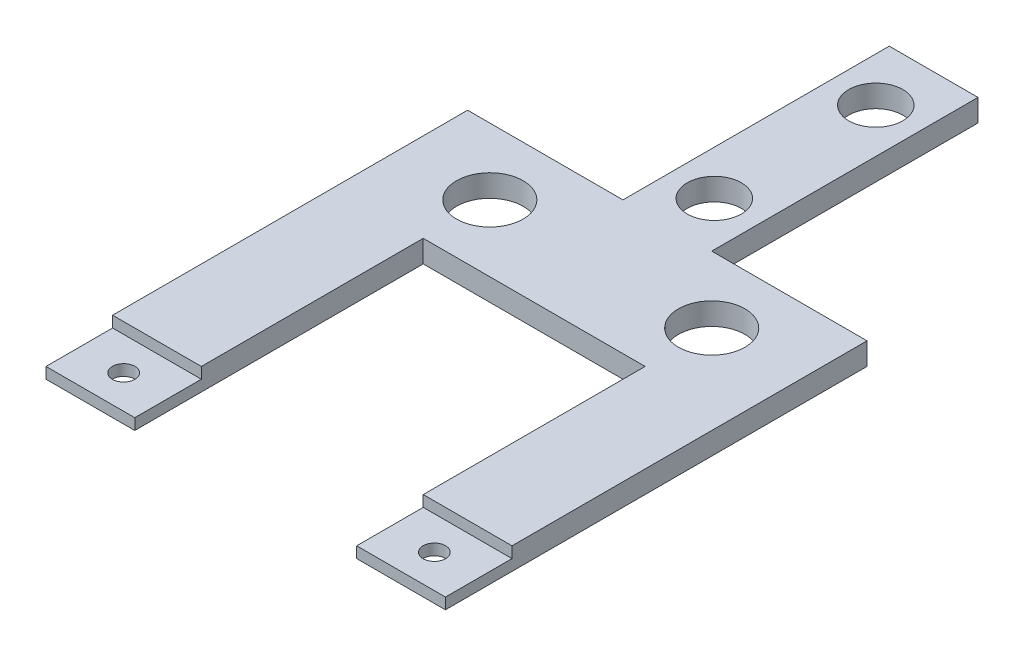
ISO-10303-21;
HEADER;
FILE_DESCRIPTION(('STEP AP214'),'2;1');
FILE_NAME('part.step','',(''),(''),'','','');
FILE_SCHEMA(('AUTOMOTIVE_DESIGN { 1 0 10303 214 1 1 1 1 }'));
ENDSEC;
DATA;
#1=APPLICATION_CONTEXT('core data for automotive mechanical design processes');
#2=APPLICATION_PROTOCOL_DEFINITION('international standard','automotive_design',2000,#1);
#3=PRODUCT_CONTEXT('',#1,'mechanical');
#4=PRODUCT('Part','Part','',(#3));
#5=PRODUCT_RELATED_PRODUCT_CATEGORY('part','',(#4));
#6=PRODUCT_DEFINITION_FORMATION('','',#4);
#7=PRODUCT_DEFINITION_CONTEXT('part definition',#1,'design');
#8=PRODUCT_DEFINITION('design','',#6,#7);
#9=PRODUCT_DEFINITION_SHAPE('','',#8);
#10=(LENGTH_UNIT() NAMED_UNIT(*) SI_UNIT(.MILLI.,.METRE.));
#11=(NAMED_UNIT(*) PLANE_ANGLE_UNIT() SI_UNIT($,.RADIAN.));
#12=(NAMED_UNIT(*) SI_UNIT($,.STERADIAN.) SOLID_ANGLE_UNIT());
#13=UNCERTAINTY_MEASURE_WITH_UNIT(LENGTH_MEASURE(1.E-05),#10,'distance_accuracy_value','');
#14=(GEOMETRIC_REPRESENTATION_CONTEXT(3) GLOBAL_UNCERTAINTY_ASSIGNED_CONTEXT((#13)) GLOBAL_UNIT_ASSIGNED_CONTEXT((#10,
#11,#12)) REPRESENTATION_CONTEXT('',''));
#15=CARTESIAN_POINT('',(0.,0.,0.));
#16=DIRECTION('',(0.,0.,1.));
#17=DIRECTION('',(1.,0.,0.));
#18=AXIS2_PLACEMENT_3D('',#15,#16,#17);
#19=CARTESIAN_POINT('',(0.,0.79375,-5.55625));
#20=DIRECTION('',(0.,0.,-1.));
#21=DIRECTION('',(-1.,0.,0.));
#22=AXIS2_PLACEMENT_3D('',#19,#20,#21);
#23=PLANE('',#22);
#24=DIRECTION('',(1.,0.,0.));
#25=VECTOR('',#24,1.);
#26=CARTESIAN_POINT('',(0.,-0.79375,-5.55625));
#27=LINE('',#26,#25);
#28=CARTESIAN_POINT('',(-7.9375,-0.79375,-5.55625));
#29=VERTEX_POINT('',#28);
#30=CARTESIAN_POINT('',(7.9375,-0.79375,-5.55625));
#31=VERTEX_POINT('',#30);
#32=EDGE_CURVE('E255',#29,#31,#27,.T.);
#33=ORIENTED_EDGE('',*,*,#32,.T.);
#34=DIRECTION('',(0.,-1.,0.));
#35=VECTOR('',#34,1.);
#36=CARTESIAN_POINT('',(7.9375,0.79375,-5.55625));
#37=LINE('',#36,#35);
#38=CARTESIAN_POINT('',(7.9375,0.79375,-5.55625));
#39=VERTEX_POINT('',#38);
#40=EDGE_CURVE('E270',#39,#31,#37,.T.);
#41=ORIENTED_EDGE('',*,*,#40,.F.);
#42=DIRECTION('',(1.,0.,0.));
#43=VECTOR('',#42,1.);
#44=CARTESIAN_POINT('',(0.,0.79375,-5.55625));
#45=LINE('',#44,#43);
#46=CARTESIAN_POINT('',(-7.9375,0.79375,-5.55625));
#47=VERTEX_POINT('',#46);
#48=EDGE_CURVE('E267',#47,#39,#45,.T.);
#49=ORIENTED_EDGE('',*,*,#48,.F.);
#50=DIRECTION('',(0.,-1.,0.));
#51=VECTOR('',#50,1.);
#52=CARTESIAN_POINT('',(-7.9375,0.79375,-5.55625));
#53=LINE('',#52,#51);
#54=EDGE_CURVE('E181',#47,#29,#53,.T.);
#55=ORIENTED_EDGE('',*,*,#54,.T.);
#56=EDGE_LOOP('',(#33,#41,#49,#55));
#57=FACE_BOUND('',#56,.T.);
#58=ADVANCED_FACE('F37',(#57),#23,.F.);
#59=CARTESIAN_POINT('',(-7.9375,0.79375,0.));
#60=DIRECTION('',(-1.,0.,0.));
#61=DIRECTION('',(0.,0.,1.));
#62=AXIS2_PLACEMENT_3D('',#59,#60,#61);
#63=PLANE('',#62);
#64=DIRECTION('',(0.,0.,-1.));
#65=VECTOR('',#64,1.);
#66=CARTESIAN_POINT('',(-7.9375,0.79375,0.));
#67=LINE('',#66,#65);
#68=CARTESIAN_POINT('',(-7.9375,0.79375,10.31875));
#69=VERTEX_POINT('',#68);
#70=EDGE_CURVE('E265',#69,#47,#67,.T.);
#71=ORIENTED_EDGE('',*,*,#70,.F.);
#72=DIRECTION('',(0.,1.,0.));
#73=VECTOR('',#72,1.);
#74=CARTESIAN_POINT('',(-7.9375,0.,10.31875));
#75=LINE('',#74,#73);
#76=CARTESIAN_POINT('',(-7.9375,0.,10.31875));
#77=VERTEX_POINT('',#76);
#78=EDGE_CURVE('E54',#77,#69,#75,.T.);
#79=ORIENTED_EDGE('',*,*,#78,.F.);
#80=DIRECTION('',(0.,0.,-1.));
#81=VECTOR('',#80,1.);
#82=CARTESIAN_POINT('',(-7.9375,0.,15.08125));
#83=LINE('',#82,#81);
#84=CARTESIAN_POINT('',(-7.9375,0.,15.08125));
#85=VERTEX_POINT('',#84);
#86=EDGE_CURVE('E171',#85,#77,#83,.T.);
#87=ORIENTED_EDGE('',*,*,#86,.F.);
#88=DIRECTION('',(0.,-1.,0.));
#89=VECTOR('',#88,1.);
#90=CARTESIAN_POINT('',(-7.9375,0.79375,15.08125));
#91=LINE('',#90,#89);
#92=CARTESIAN_POINT('',(-7.9375,-0.79375,15.08125));
#93=VERTEX_POINT('',#92);
#94=EDGE_CURVE('E170',#85,#93,#91,.T.);
#95=ORIENTED_EDGE('',*,*,#94,.T.);
#96=DIRECTION('',(0.,0.,-1.));
#97=VECTOR('',#96,1.);
#98=CARTESIAN_POINT('',(-7.9375,-0.79375,0.));
#99=LINE('',#98,#97);
#100=EDGE_CURVE('E285',#93,#29,#99,.T.);
#101=ORIENTED_EDGE('',*,*,#100,.T.);
#102=ORIENTED_EDGE('',*,*,#54,.F.);
#103=EDGE_LOOP('',(#71,#79,#87,#95,#101,#102));
#104=FACE_BOUND('',#103,.T.);
#105=ADVANCED_FACE('F309',(#104),#63,.F.);
#106=CARTESIAN_POINT('',(0.,0.79375,15.08125));
#107=DIRECTION('',(0.,0.,-1.));
#108=DIRECTION('',(-1.,0.,0.));
#109=AXIS2_PLACEMENT_3D('',#106,#107,#108);
#110=PLANE('',#109);
#111=ORIENTED_EDGE('',*,*,#94,.F.);
#112=DIRECTION('',(1.,0.,0.));
#113=VECTOR('',#112,1.);
#114=CARTESIAN_POINT('',(-14.2875,0.,15.08125));
#115=LINE('',#114,#113);
#116=CARTESIAN_POINT('',(-14.2875,0.,15.08125));
#117=VERTEX_POINT('',#116);
#118=EDGE_CURVE('E156',#117,#85,#115,.T.);
#119=ORIENTED_EDGE('',*,*,#118,.F.);
#120=DIRECTION('',(0.,-1.,0.));
#121=VECTOR('',#120,1.);
#122=CARTESIAN_POINT('',(-14.2875,0.79375,15.08125));
#123=LINE('',#122,#121);
#124=CARTESIAN_POINT('',(-14.2875,-0.79375,15.08125));
#125=VERTEX_POINT('',#124);
#126=EDGE_CURVE('E168',#117,#125,#123,.T.);
#127=ORIENTED_EDGE('',*,*,#126,.T.);
#128=DIRECTION('',(1.,0.,0.));
#129=VECTOR('',#128,1.);
#130=CARTESIAN_POINT('',(0.,-0.79375,15.08125));
#131=LINE('',#130,#129);
#132=EDGE_CURVE('E277',#125,#93,#131,.T.);
#133=ORIENTED_EDGE('',*,*,#132,.T.);
#134=EDGE_LOOP('',(#111,#119,#127,#133));
#135=FACE_BOUND('',#134,.T.);
#136=ADVANCED_FACE('F166',(#135),#110,.F.);
#137=DIRECTION('',(0.,-1.,0.));
#138=VECTOR('',#137,1.);
#139=CARTESIAN_POINT('',(14.2875,0.79375,15.08125));
#140=LINE('',#139,#138);
#141=CARTESIAN_POINT('',(14.2875,0.,15.08125));
#142=VERTEX_POINT('',#141);
#143=CARTESIAN_POINT('',(14.2875,-0.79375,15.08125));
#144=VERTEX_POINT('',#143);
#145=EDGE_CURVE('E187',#142,#144,#140,.T.);
#146=ORIENTED_EDGE('',*,*,#145,.F.);
#147=DIRECTION('',(1.,0.,0.));
#148=VECTOR('',#147,1.);
#149=CARTESIAN_POINT('',(7.9375,0.,15.08125));
#150=LINE('',#149,#148);
#151=CARTESIAN_POINT('',(7.9375,0.,15.08125));
#152=VERTEX_POINT('',#151);
#153=EDGE_CURVE('E241',#152,#142,#150,.T.);
#154=ORIENTED_EDGE('',*,*,#153,.F.);
#155=DIRECTION('',(0.,-1.,0.));
#156=VECTOR('',#155,1.);
#157=CARTESIAN_POINT('',(7.9375,0.79375,15.08125));
#158=LINE('',#157,#156);
#159=CARTESIAN_POINT('',(7.9375,-0.79375,15.08125));
#160=VERTEX_POINT('',#159);
#161=EDGE_CURVE('E189',#152,#160,#158,.T.);
#162=ORIENTED_EDGE('',*,*,#161,.T.);
#163=EDGE_CURVE('E273',#160,#144,#131,.T.);
#164=ORIENTED_EDGE('',*,*,#163,.T.);
#165=EDGE_LOOP('',(#146,#154,#162,#164));
#166=FACE_BOUND('',#165,.T.);
#167=ADVANCED_FACE('F341',(#166),#110,.F.);
#168=CARTESIAN_POINT('',(7.9375,0.79375,0.));
#169=DIRECTION('',(-1.,0.,0.));
#170=DIRECTION('',(0.,0.,1.));
#171=AXIS2_PLACEMENT_3D('',#168,#169,#170);
#172=PLANE('',#171);
#173=DIRECTION('',(0.,1.,0.));
#174=VECTOR('',#173,1.);
#175=CARTESIAN_POINT('',(7.9375,0.,10.31875));
#176=LINE('',#175,#174);
#177=CARTESIAN_POINT('',(7.9375,0.,10.31875));
#178=VERTEX_POINT('',#177);
#179=CARTESIAN_POINT('',(7.9375,0.79375,10.31875));
#180=VERTEX_POINT('',#179);
#181=EDGE_CURVE('E236',#178,#180,#176,.T.);
#182=ORIENTED_EDGE('',*,*,#181,.T.);
#183=DIRECTION('',(0.,0.,-1.));
#184=VECTOR('',#183,1.);
#185=CARTESIAN_POINT('',(7.9375,0.79375,0.));
#186=LINE('',#185,#184);
#187=EDGE_CURVE('E252',#180,#39,#186,.T.);
#188=ORIENTED_EDGE('',*,*,#187,.T.);
#189=ORIENTED_EDGE('',*,*,#40,.T.);
#190=DIRECTION('',(0.,0.,-1.));
#191=VECTOR('',#190,1.);
#192=CARTESIAN_POINT('',(7.9375,-0.79375,0.));
#193=LINE('',#192,#191);
#194=EDGE_CURVE('E212',#160,#31,#193,.T.);
#195=ORIENTED_EDGE('',*,*,#194,.F.);
#196=ORIENTED_EDGE('',*,*,#161,.F.);
#197=DIRECTION('',(0.,0.,1.));
#198=VECTOR('',#197,1.);
#199=CARTESIAN_POINT('',(7.9375,0.,15.08125));
#200=LINE('',#199,#198);
#201=EDGE_CURVE('E239',#178,#152,#200,.T.);
#202=ORIENTED_EDGE('',*,*,#201,.F.);
#203=EDGE_LOOP('',(#182,#188,#189,#195,#196,#202));
#204=FACE_BOUND('',#203,.T.);
#205=ADVANCED_FACE('F304',(#204),#172,.T.);
#206=CARTESIAN_POINT('',(14.2875,0.79375,0.));
#207=DIRECTION('',(1.,0.,0.));
#208=DIRECTION('',(0.,0.,-1.));
#209=AXIS2_PLACEMENT_3D('',#206,#207,#208);
#210=PLANE('',#209);
#211=DIRECTION('',(0.,1.,0.));
#212=VECTOR('',#211,1.);
#213=CARTESIAN_POINT('',(14.2875,0.,10.31875));
#214=LINE('',#213,#212);
#215=CARTESIAN_POINT('',(14.2875,0.,10.31875));
#216=VERTEX_POINT('',#215);
#217=CARTESIAN_POINT('',(14.2875,0.79375,10.31875));
#218=VERTEX_POINT('',#217);
#219=EDGE_CURVE('E62',#216,#218,#214,.T.);
#220=ORIENTED_EDGE('',*,*,#219,.F.);
#221=DIRECTION('',(0.,0.,-1.));
#222=VECTOR('',#221,1.);
#223=CARTESIAN_POINT('',(14.2875,0.,15.08125));
#224=LINE('',#223,#222);
#225=EDGE_CURVE('E243',#142,#216,#224,.T.);
#226=ORIENTED_EDGE('',*,*,#225,.F.);
#227=ORIENTED_EDGE('',*,*,#145,.T.);
#228=DIRECTION('',(0.,0.,1.));
#229=VECTOR('',#228,1.);
#230=CARTESIAN_POINT('',(14.2875,-0.79375,0.));
#231=LINE('',#230,#229);
#232=CARTESIAN_POINT('',(14.2875,-0.79375,-15.08125));
#233=VERTEX_POINT('',#232);
#234=EDGE_CURVE('E276',#233,#144,#231,.T.);
#235=ORIENTED_EDGE('',*,*,#234,.F.);
#236=DIRECTION('',(0.,-1.,0.));
#237=VECTOR('',#236,1.);
#238=CARTESIAN_POINT('',(14.2875,0.79375,-15.08125));
#239=LINE('',#238,#237);
#240=CARTESIAN_POINT('',(14.2875,0.79375,-15.08125));
#241=VERTEX_POINT('',#240);
#242=EDGE_CURVE('E179',#241,#233,#239,.T.);
#243=ORIENTED_EDGE('',*,*,#242,.F.);
#244=DIRECTION('',(0.,0.,1.));
#245=VECTOR('',#244,1.);
#246=CARTESIAN_POINT('',(14.2875,0.79375,0.));
#247=LINE('',#246,#245);
#248=EDGE_CURVE('E254',#241,#218,#247,.T.);
#249=ORIENTED_EDGE('',*,*,#248,.T.);
#250=EDGE_LOOP('',(#220,#226,#227,#235,#243,#249));
#251=FACE_BOUND('',#250,.T.);
#252=ADVANCED_FACE('F336',(#251),#210,.T.);
#253=CARTESIAN_POINT('',(-14.2875,0.79375,0.));
#254=DIRECTION('',(1.,0.,0.));
#255=DIRECTION('',(0.,0.,-1.));
#256=AXIS2_PLACEMENT_3D('',#253,#254,#255);
#257=PLANE('',#256);
#258=DIRECTION('',(0.,0.,1.));
#259=VECTOR('',#258,1.);
#260=CARTESIAN_POINT('',(-14.2875,0.,15.08125));
#261=LINE('',#260,#259);
#262=CARTESIAN_POINT('',(-14.2875,0.,10.31875));
#263=VERTEX_POINT('',#262);
#264=EDGE_CURVE('E153',#263,#117,#261,.T.);
#265=ORIENTED_EDGE('',*,*,#264,.F.);
#266=DIRECTION('',(0.,1.,0.));
#267=VECTOR('',#266,1.);
#268=CARTESIAN_POINT('',(-14.2875,0.,10.31875));
#269=LINE('',#268,#267);
#270=CARTESIAN_POINT('',(-14.2875,0.79375,10.31875));
#271=VERTEX_POINT('',#270);
#272=EDGE_CURVE('E205',#263,#271,#269,.T.);
#273=ORIENTED_EDGE('',*,*,#272,.T.);
#274=DIRECTION('',(0.,0.,1.));
#275=VECTOR('',#274,1.);
#276=CARTESIAN_POINT('',(-14.2875,0.79375,0.));
#277=LINE('',#276,#275);
#278=CARTESIAN_POINT('',(-14.2875,0.79375,-15.08125));
#279=VERTEX_POINT('',#278);
#280=EDGE_CURVE('E262',#279,#271,#277,.T.);
#281=ORIENTED_EDGE('',*,*,#280,.F.);
#282=DIRECTION('',(0.,-1.,0.));
#283=VECTOR('',#282,1.);
#284=CARTESIAN_POINT('',(-14.2875,0.79375,-15.08125));
#285=LINE('',#284,#283);
#286=CARTESIAN_POINT('',(-14.2875,-0.79375,-15.08125));
#287=VERTEX_POINT('',#286);
#288=EDGE_CURVE('E177',#279,#287,#285,.T.);
#289=ORIENTED_EDGE('',*,*,#288,.T.);
#290=DIRECTION('',(0.,0.,1.));
#291=VECTOR('',#290,1.);
#292=CARTESIAN_POINT('',(-14.2875,-0.79375,0.));
#293=LINE('',#292,#291);
#294=EDGE_CURVE('E175',#287,#125,#293,.T.);
#295=ORIENTED_EDGE('',*,*,#294,.T.);
#296=ORIENTED_EDGE('',*,*,#126,.F.);
#297=EDGE_LOOP('',(#265,#273,#281,#289,#295,#296));
#298=FACE_BOUND('',#297,.T.);
#299=ADVANCED_FACE('F173',(#298),#257,.F.);
#300=CARTESIAN_POINT('',(0.,-0.79375,0.));
#301=DIRECTION('',(0.,1.,0.));
#302=DIRECTION('',(0.,0.,1.));
#303=AXIS2_PLACEMENT_3D('',#300,#301,#302);
#304=PLANE('',#303);
#305=CARTESIAN_POINT('',(-1.04723595372771E-13,-0.79375,-29.9940298141337));
#306=DIRECTION('',(0.,1.,0.));
#307=DIRECTION('',(0.,0.,1.));
#308=AXIS2_PLACEMENT_3D('',#305,#306,#307);
#309=CIRCLE('',#308,1.93642078285106);
#310=CARTESIAN_POINT('',(-1.04723595372771E-13,-0.79375,-28.0576090312826));
#311=VERTEX_POINT('',#310);
#312=EDGE_CURVE('E230',#311,#311,#309,.F.);
#313=ORIENTED_EDGE('',*,*,#312,.F.);
#314=EDGE_LOOP('',(#313));
#315=FACE_BOUND('',#314,.T.);
#316=CARTESIAN_POINT('',(-7.9375,-0.79375,-10.31875));
#317=DIRECTION('',(0.,1.,0.));
#318=DIRECTION('',(0.,0.,1.));
#319=AXIS2_PLACEMENT_3D('',#316,#317,#318);
#320=CIRCLE('',#319,2.38125);
#321=CARTESIAN_POINT('',(-7.9375,-0.79375,-7.9375));
#322=VERTEX_POINT('',#321);
#323=EDGE_CURVE('E222',#322,#322,#320,.F.);
#324=ORIENTED_EDGE('',*,*,#323,.F.);
#325=EDGE_LOOP('',(#324));
#326=FACE_BOUND('',#325,.T.);
#327=CARTESIAN_POINT('',(11.1125000000001,-0.79375,12.7));
#328=DIRECTION('',(0.,1.,0.));
#329=DIRECTION('',(0.,0.,1.));
#330=AXIS2_PLACEMENT_3D('',#327,#328,#329);
#331=CIRCLE('',#330,0.806450000000001);
#332=CARTESIAN_POINT('',(11.1125000000001,-0.79375,13.50645));
#333=VERTEX_POINT('',#332);
#334=EDGE_CURVE('E558',#333,#333,#331,.F.);
#335=ORIENTED_EDGE('',*,*,#334,.F.);
#336=EDGE_LOOP('',(#335));
#337=FACE_BOUND('',#336,.T.);
#338=CARTESIAN_POINT('',(7.93749999999993,-0.79375,-10.31875));
#339=DIRECTION('',(0.,1.,0.));
#340=DIRECTION('',(0.,0.,1.));
#341=AXIS2_PLACEMENT_3D('',#338,#339,#340);
#342=CIRCLE('',#341,2.38125000000001);
#343=CARTESIAN_POINT('',(7.93749999999993,-0.79375,-7.93749999999999));
#344=VERTEX_POINT('',#343);
#345=EDGE_CURVE('E560',#344,#344,#342,.F.);
#346=ORIENTED_EDGE('',*,*,#345,.F.);
#347=EDGE_LOOP('',(#346));
#348=FACE_BOUND('',#347,.T.);
#349=CARTESIAN_POINT('',(0.,-0.79375,-18.4420160203729));
#350=DIRECTION('',(0.,1.,0.));
#351=DIRECTION('',(0.,0.,1.));
#352=AXIS2_PLACEMENT_3D('',#349,#350,#351);
#353=CIRCLE('',#352,1.93642078285106);
#354=CARTESIAN_POINT('',(0.,-0.79375,-16.5055952375218));
#355=VERTEX_POINT('',#354);
#356=EDGE_CURVE('E564',#355,#355,#353,.F.);
#357=ORIENTED_EDGE('',*,*,#356,.F.);
#358=EDGE_LOOP('',(#357));
#359=FACE_BOUND('',#358,.T.);
#360=CARTESIAN_POINT('',(-11.1125,-0.79375,12.7));
#361=DIRECTION('',(0.,1.,0.));
#362=DIRECTION('',(0.,0.,1.));
#363=AXIS2_PLACEMENT_3D('',#360,#361,#362);
#364=CIRCLE('',#363,0.806450000000001);
#365=CARTESIAN_POINT('',(-11.1125,-0.79375,13.50645));
#366=VERTEX_POINT('',#365);
#367=EDGE_CURVE('E216',#366,#366,#364,.F.);
#368=ORIENTED_EDGE('',*,*,#367,.F.);
#369=EDGE_LOOP('',(#368));
#370=FACE_BOUND('',#369,.T.);
#371=ORIENTED_EDGE('',*,*,#194,.T.);
#372=ORIENTED_EDGE('',*,*,#32,.F.);
#373=ORIENTED_EDGE('',*,*,#100,.F.);
#374=ORIENTED_EDGE('',*,*,#132,.F.);
#375=ORIENTED_EDGE('',*,*,#294,.F.);
#376=DIRECTION('',(1.,0.,0.));
#377=VECTOR('',#376,1.);
#378=CARTESIAN_POINT('',(0.,-0.79375,-15.08125));
#379=LINE('',#378,#377);
#380=CARTESIAN_POINT('',(-3.175,-0.79375,-15.08125));
#381=VERTEX_POINT('',#380);
#382=EDGE_CURVE('E281',#287,#381,#379,.T.);
#383=ORIENTED_EDGE('',*,*,#382,.T.);
#384=DIRECTION('',(0.,0.,-1.));
#385=VECTOR('',#384,1.);
#386=CARTESIAN_POINT('',(-3.175,-0.79375,-15.08125));
#387=LINE('',#386,#385);
#388=CARTESIAN_POINT('',(-3.175,-0.79375,-34.13125));
#389=VERTEX_POINT('',#388);
#390=EDGE_CURVE('E195',#381,#389,#387,.T.);
#391=ORIENTED_EDGE('',*,*,#390,.T.);
#392=DIRECTION('',(1.,0.,0.));
#393=VECTOR('',#392,1.);
#394=CARTESIAN_POINT('',(-3.175,-0.79375,-34.13125));
#395=LINE('',#394,#393);
#396=CARTESIAN_POINT('',(3.175,-0.79375,-34.13125));
#397=VERTEX_POINT('',#396);
#398=EDGE_CURVE('E201',#389,#397,#395,.T.);
#399=ORIENTED_EDGE('',*,*,#398,.T.);
#400=DIRECTION('',(0.,0.,-1.));
#401=VECTOR('',#400,1.);
#402=CARTESIAN_POINT('',(3.175,-0.79375,-15.08125));
#403=LINE('',#402,#401);
#404=CARTESIAN_POINT('',(3.175,-0.79375,-15.08125));
#405=VERTEX_POINT('',#404);
#406=EDGE_CURVE('E204',#405,#397,#403,.T.);
#407=ORIENTED_EDGE('',*,*,#406,.F.);
#408=EDGE_CURVE('E280',#405,#233,#379,.T.);
#409=ORIENTED_EDGE('',*,*,#408,.T.);
#410=ORIENTED_EDGE('',*,*,#234,.T.);
#411=ORIENTED_EDGE('',*,*,#163,.F.);
#412=EDGE_LOOP('',(#371,#372,#373,#374,#375,#383,#391,#399,#407,#409,#410,#411));
#413=FACE_BOUND('',#412,.T.);
#414=ADVANCED_FACE('F299',(#315,#326,#337,#348,#359,#370,#413),#304,.F.);
#415=CARTESIAN_POINT('',(0.,0.79375,0.));
#416=DIRECTION('',(0.,1.,0.));
#417=DIRECTION('',(0.,0.,1.));
#418=AXIS2_PLACEMENT_3D('',#415,#416,#417);
#419=PLANE('',#418);
#420=CARTESIAN_POINT('',(-1.04723595372771E-13,0.79375,-29.9940298141337));
#421=DIRECTION('',(0.,1.,0.));
#422=DIRECTION('',(0.,0.,1.));
#423=AXIS2_PLACEMENT_3D('',#420,#421,#422);
#424=CIRCLE('',#423,1.93642078285106);
#425=CARTESIAN_POINT('',(-1.04723595372771E-13,0.79375,-28.0576090312826));
#426=VERTEX_POINT('',#425);
#427=EDGE_CURVE('E555',#426,#426,#424,.T.);
#428=ORIENTED_EDGE('',*,*,#427,.F.);
#429=EDGE_LOOP('',(#428));
#430=FACE_BOUND('',#429,.T.);
#431=CARTESIAN_POINT('',(-7.9375,0.79375,-10.31875));
#432=DIRECTION('',(0.,1.,0.));
#433=DIRECTION('',(0.,0.,1.));
#434=AXIS2_PLACEMENT_3D('',#431,#432,#433);
#435=CIRCLE('',#434,2.38125);
#436=CARTESIAN_POINT('',(-7.9375,0.79375,-7.9375));
#437=VERTEX_POINT('',#436);
#438=EDGE_CURVE('E227',#437,#437,#435,.T.);
#439=ORIENTED_EDGE('',*,*,#438,.F.);
#440=EDGE_LOOP('',(#439));
#441=FACE_BOUND('',#440,.T.);
#442=CARTESIAN_POINT('',(7.93749999999993,0.79375,-10.31875));
#443=DIRECTION('',(0.,1.,0.));
#444=DIRECTION('',(0.,0.,1.));
#445=AXIS2_PLACEMENT_3D('',#442,#443,#444);
#446=CIRCLE('',#445,2.38125000000001);
#447=CARTESIAN_POINT('',(7.93749999999993,0.79375,-7.93749999999999));
#448=VERTEX_POINT('',#447);
#449=EDGE_CURVE('E567',#448,#448,#446,.T.);
#450=ORIENTED_EDGE('',*,*,#449,.F.);
#451=EDGE_LOOP('',(#450));
#452=FACE_BOUND('',#451,.T.);
#453=CARTESIAN_POINT('',(0.,0.79375,-18.4420160203729));
#454=DIRECTION('',(0.,1.,0.));
#455=DIRECTION('',(0.,0.,1.));
#456=AXIS2_PLACEMENT_3D('',#453,#454,#455);
#457=CIRCLE('',#456,1.93642078285106);
#458=CARTESIAN_POINT('',(0.,0.79375,-16.5055952375218));
#459=VERTEX_POINT('',#458);
#460=EDGE_CURVE('E556',#459,#459,#457,.T.);
#461=ORIENTED_EDGE('',*,*,#460,.F.);
#462=EDGE_LOOP('',(#461));
#463=FACE_BOUND('',#462,.T.);
#464=DIRECTION('',(-1.,0.,0.));
#465=VECTOR('',#464,1.);
#466=CARTESIAN_POINT('',(-14.2875,0.79375,10.31875));
#467=LINE('',#466,#465);
#468=EDGE_CURVE('E162',#69,#271,#467,.T.);
#469=ORIENTED_EDGE('',*,*,#468,.F.);
#470=ORIENTED_EDGE('',*,*,#70,.T.);
#471=ORIENTED_EDGE('',*,*,#48,.T.);
#472=ORIENTED_EDGE('',*,*,#187,.F.);
#473=DIRECTION('',(-1.,0.,0.));
#474=VECTOR('',#473,1.);
#475=CARTESIAN_POINT('',(7.9375,0.79375,10.31875));
#476=LINE('',#475,#474);
#477=EDGE_CURVE('E220',#218,#180,#476,.T.);
#478=ORIENTED_EDGE('',*,*,#477,.F.);
#479=ORIENTED_EDGE('',*,*,#248,.F.);
#480=DIRECTION('',(1.,0.,0.));
#481=VECTOR('',#480,1.);
#482=CARTESIAN_POINT('',(0.,0.79375,-15.08125));
#483=LINE('',#482,#481);
#484=CARTESIAN_POINT('',(3.175,0.79375,-15.08125));
#485=VERTEX_POINT('',#484);
#486=EDGE_CURVE('E258',#485,#241,#483,.T.);
#487=ORIENTED_EDGE('',*,*,#486,.F.);
#488=DIRECTION('',(0.,0.,-1.));
#489=VECTOR('',#488,1.);
#490=CARTESIAN_POINT('',(3.175,0.79375,-15.08125));
#491=LINE('',#490,#489);
#492=CARTESIAN_POINT('',(3.175,0.79375,-34.13125));
#493=VERTEX_POINT('',#492);
#494=EDGE_CURVE('E194',#485,#493,#491,.T.);
#495=ORIENTED_EDGE('',*,*,#494,.T.);
#496=DIRECTION('',(1.,0.,0.));
#497=VECTOR('',#496,1.);
#498=CARTESIAN_POINT('',(-3.175,0.79375,-34.13125));
#499=LINE('',#498,#497);
#500=CARTESIAN_POINT('',(-3.175,0.79375,-34.13125));
#501=VERTEX_POINT('',#500);
#502=EDGE_CURVE('E191',#501,#493,#499,.T.);
#503=ORIENTED_EDGE('',*,*,#502,.F.);
#504=DIRECTION('',(0.,0.,-1.));
#505=VECTOR('',#504,1.);
#506=CARTESIAN_POINT('',(-3.175,0.79375,-15.08125));
#507=LINE('',#506,#505);
#508=CARTESIAN_POINT('',(-3.175,0.79375,-15.08125));
#509=VERTEX_POINT('',#508);
#510=EDGE_CURVE('E197',#509,#501,#507,.T.);
#511=ORIENTED_EDGE('',*,*,#510,.F.);
#512=EDGE_CURVE('E259',#279,#509,#483,.T.);
#513=ORIENTED_EDGE('',*,*,#512,.F.);
#514=ORIENTED_EDGE('',*,*,#280,.T.);
#515=EDGE_LOOP('',(#469,#470,#471,#472,#478,#479,#487,#495,#503,#511,#513,#514));
#516=FACE_BOUND('',#515,.T.);
#517=ADVANCED_FACE('F308',(#430,#441,#452,#463,#516),#419,.T.);
#518=CARTESIAN_POINT('',(0.,0.79375,-15.08125));
#519=DIRECTION('',(0.,0.,-1.));
#520=DIRECTION('',(-1.,0.,0.));
#521=AXIS2_PLACEMENT_3D('',#518,#519,#520);
#522=PLANE('',#521);
#523=ORIENTED_EDGE('',*,*,#512,.T.);
#524=DIRECTION('',(0.,-1.,0.));
#525=VECTOR('',#524,1.);
#526=CARTESIAN_POINT('',(-3.175,0.79375,-15.08125));
#527=LINE('',#526,#525);
#528=EDGE_CURVE('E46',#509,#381,#527,.T.);
#529=ORIENTED_EDGE('',*,*,#528,.T.);
#530=ORIENTED_EDGE('',*,*,#382,.F.);
#531=ORIENTED_EDGE('',*,*,#288,.F.);
#532=EDGE_LOOP('',(#523,#529,#530,#531));
#533=FACE_BOUND('',#532,.T.);
#534=ADVANCED_FACE('F316',(#533),#522,.T.);
#535=DIRECTION('',(0.,-1.,0.));
#536=VECTOR('',#535,1.);
#537=CARTESIAN_POINT('',(3.175,0.79375,-15.08125));
#538=LINE('',#537,#536);
#539=EDGE_CURVE('E11',#485,#405,#538,.T.);
#540=ORIENTED_EDGE('',*,*,#539,.F.);
#541=ORIENTED_EDGE('',*,*,#486,.T.);
#542=ORIENTED_EDGE('',*,*,#242,.T.);
#543=ORIENTED_EDGE('',*,*,#408,.F.);
#544=EDGE_LOOP('',(#540,#541,#542,#543));
#545=FACE_BOUND('',#544,.T.);
#546=ADVANCED_FACE('F330',(#545),#522,.T.);
#547=CARTESIAN_POINT('',(-3.175,0.79375,-34.13125));
#548=DIRECTION('',(0.,0.,-1.));
#549=DIRECTION('',(-1.,0.,0.));
#550=AXIS2_PLACEMENT_3D('',#547,#548,#549);
#551=PLANE('',#550);
#552=ORIENTED_EDGE('',*,*,#398,.F.);
#553=DIRECTION('',(0.,-1.,0.));
#554=VECTOR('',#553,1.);
#555=CARTESIAN_POINT('',(-3.175,0.79375,-34.13125));
#556=LINE('',#555,#554);
#557=EDGE_CURVE('E210',#501,#389,#556,.T.);
#558=ORIENTED_EDGE('',*,*,#557,.F.);
#559=ORIENTED_EDGE('',*,*,#502,.T.);
#560=DIRECTION('',(0.,-1.,0.));
#561=VECTOR('',#560,1.);
#562=CARTESIAN_POINT('',(3.175,0.79375,-34.13125));
#563=LINE('',#562,#561);
#564=EDGE_CURVE('E200',#493,#397,#563,.T.);
#565=ORIENTED_EDGE('',*,*,#564,.T.);
#566=EDGE_LOOP('',(#552,#558,#559,#565));
#567=FACE_BOUND('',#566,.T.);
#568=ADVANCED_FACE('F39',(#567),#551,.T.);
#569=CARTESIAN_POINT('',(-3.175,0.79375,-15.08125));
#570=DIRECTION('',(-1.,0.,0.));
#571=DIRECTION('',(0.,0.,1.));
#572=AXIS2_PLACEMENT_3D('',#569,#570,#571);
#573=PLANE('',#572);
#574=ORIENTED_EDGE('',*,*,#390,.F.);
#575=ORIENTED_EDGE('',*,*,#528,.F.);
#576=ORIENTED_EDGE('',*,*,#510,.T.);
#577=ORIENTED_EDGE('',*,*,#557,.T.);
#578=EDGE_LOOP('',(#574,#575,#576,#577));
#579=FACE_BOUND('',#578,.T.);
#580=ADVANCED_FACE('F322',(#579),#573,.T.);
#581=CARTESIAN_POINT('',(3.175,0.79375,-15.08125));
#582=DIRECTION('',(-1.,0.,0.));
#583=DIRECTION('',(0.,0.,1.));
#584=AXIS2_PLACEMENT_3D('',#581,#582,#583);
#585=PLANE('',#584);
#586=ORIENTED_EDGE('',*,*,#406,.T.);
#587=ORIENTED_EDGE('',*,*,#564,.F.);
#588=ORIENTED_EDGE('',*,*,#494,.F.);
#589=ORIENTED_EDGE('',*,*,#539,.T.);
#590=EDGE_LOOP('',(#586,#587,#588,#589));
#591=FACE_BOUND('',#590,.T.);
#592=ADVANCED_FACE('F327',(#591),#585,.F.);
#593=CARTESIAN_POINT('',(7.9375,0.,10.31875));
#594=DIRECTION('',(0.,0.,-1.));
#595=DIRECTION('',(-1.,0.,0.));
#596=AXIS2_PLACEMENT_3D('',#593,#594,#595);
#597=PLANE('',#596);
#598=ORIENTED_EDGE('',*,*,#477,.T.);
#599=ORIENTED_EDGE('',*,*,#181,.F.);
#600=DIRECTION('',(-1.,0.,0.));
#601=VECTOR('',#600,1.);
#602=CARTESIAN_POINT('',(7.9375,0.,10.31875));
#603=LINE('',#602,#601);
#604=EDGE_CURVE('E245',#216,#178,#603,.T.);
#605=ORIENTED_EDGE('',*,*,#604,.F.);
#606=ORIENTED_EDGE('',*,*,#219,.T.);
#607=EDGE_LOOP('',(#598,#599,#605,#606));
#608=FACE_BOUND('',#607,.T.);
#609=ADVANCED_FACE('F344',(#608),#597,.F.);
#610=CARTESIAN_POINT('',(0.,0.,0.));
#611=DIRECTION('',(0.,-1.,0.));
#612=DIRECTION('',(0.,0.,-1.));
#613=AXIS2_PLACEMENT_3D('',#610,#611,#612);
#614=PLANE('',#613);
#615=CARTESIAN_POINT('',(11.1125000000001,0.,12.7));
#616=DIRECTION('',(0.,-1.,0.));
#617=DIRECTION('',(0.,0.,-1.));
#618=AXIS2_PLACEMENT_3D('',#615,#616,#617);
#619=CIRCLE('',#618,0.806450000000001);
#620=CARTESIAN_POINT('',(11.1125000000001,0.,11.89355));
#621=VERTEX_POINT('',#620);
#622=EDGE_CURVE('E41',#621,#621,#619,.T.);
#623=ORIENTED_EDGE('',*,*,#622,.T.);
#624=EDGE_LOOP('',(#623));
#625=FACE_BOUND('',#624,.T.);
#626=ORIENTED_EDGE('',*,*,#201,.T.);
#627=ORIENTED_EDGE('',*,*,#153,.T.);
#628=ORIENTED_EDGE('',*,*,#225,.T.);
#629=ORIENTED_EDGE('',*,*,#604,.T.);
#630=EDGE_LOOP('',(#626,#627,#628,#629));
#631=FACE_BOUND('',#630,.T.);
#632=ADVANCED_FACE('F343',(#625,#631),#614,.F.);
#633=CARTESIAN_POINT('',(-14.2875,0.,10.31875));
#634=DIRECTION('',(0.,0.,-1.));
#635=DIRECTION('',(-1.,0.,0.));
#636=AXIS2_PLACEMENT_3D('',#633,#634,#635);
#637=PLANE('',#636);
#638=ORIENTED_EDGE('',*,*,#468,.T.);
#639=ORIENTED_EDGE('',*,*,#272,.F.);
#640=DIRECTION('',(-1.,0.,0.));
#641=VECTOR('',#640,1.);
#642=CARTESIAN_POINT('',(-14.2875,0.,10.31875));
#643=LINE('',#642,#641);
#644=EDGE_CURVE('E158',#77,#263,#643,.T.);
#645=ORIENTED_EDGE('',*,*,#644,.F.);
#646=ORIENTED_EDGE('',*,*,#78,.T.);
#647=EDGE_LOOP('',(#638,#639,#645,#646));
#648=FACE_BOUND('',#647,.T.);
#649=ADVANCED_FACE('F310',(#648),#637,.F.);
#650=CARTESIAN_POINT('',(0.,0.,0.));
#651=DIRECTION('',(0.,-1.,0.));
#652=DIRECTION('',(0.,0.,-1.));
#653=AXIS2_PLACEMENT_3D('',#650,#651,#652);
#654=PLANE('',#653);
#655=CARTESIAN_POINT('',(-11.1125,0.,12.7));
#656=DIRECTION('',(0.,-1.,0.));
#657=DIRECTION('',(0.,0.,-1.));
#658=AXIS2_PLACEMENT_3D('',#655,#656,#657);
#659=CIRCLE('',#658,0.806450000000001);
#660=CARTESIAN_POINT('',(-11.1125,0.,11.89355));
#661=VERTEX_POINT('',#660);
#662=EDGE_CURVE('E214',#661,#661,#659,.T.);
#663=ORIENTED_EDGE('',*,*,#662,.T.);
#664=EDGE_LOOP('',(#663));
#665=FACE_BOUND('',#664,.T.);
#666=ORIENTED_EDGE('',*,*,#264,.T.);
#667=ORIENTED_EDGE('',*,*,#118,.T.);
#668=ORIENTED_EDGE('',*,*,#86,.T.);
#669=ORIENTED_EDGE('',*,*,#644,.T.);
#670=EDGE_LOOP('',(#666,#667,#668,#669));
#671=FACE_BOUND('',#670,.T.);
#672=ADVANCED_FACE('F155',(#665,#671),#654,.F.);
#673=CARTESIAN_POINT('',(-11.1125,-7.52894209080189,12.7));
#674=DIRECTION('',(0.,1.,0.));
#675=DIRECTION('',(0.,0.,1.));
#676=AXIS2_PLACEMENT_3D('',#673,#674,#675);
#677=CYLINDRICAL_SURFACE('',#676,0.806450000000001);
#678=ORIENTED_EDGE('',*,*,#367,.T.);
#679=EDGE_LOOP('',(#678));
#680=FACE_BOUND('',#679,.T.);
#681=ORIENTED_EDGE('',*,*,#662,.F.);
#682=EDGE_LOOP('',(#681));
#683=FACE_BOUND('',#682,.T.);
#684=ADVANCED_FACE('F487',(#680,#683),#677,.F.);
#685=CARTESIAN_POINT('',(11.1125000000001,-7.52894209080189,12.7));
#686=DIRECTION('',(0.,1.,0.));
#687=DIRECTION('',(0.,0.,1.));
#688=AXIS2_PLACEMENT_3D('',#685,#686,#687);
#689=CYLINDRICAL_SURFACE('',#688,0.806450000000001);
#690=ORIENTED_EDGE('',*,*,#334,.T.);
#691=EDGE_LOOP('',(#690));
#692=FACE_BOUND('',#691,.T.);
#693=ORIENTED_EDGE('',*,*,#622,.F.);
#694=EDGE_LOOP('',(#693));
#695=FACE_BOUND('',#694,.T.);
#696=ADVANCED_FACE('F495',(#692,#695),#689,.F.);
#697=CARTESIAN_POINT('',(0.,-7.52894209080189,-18.4420160203729));
#698=DIRECTION('',(0.,1.,0.));
#699=DIRECTION('',(0.,0.,1.));
#700=AXIS2_PLACEMENT_3D('',#697,#698,#699);
#701=CYLINDRICAL_SURFACE('',#700,1.93642078285106);
#702=ORIENTED_EDGE('',*,*,#356,.T.);
#703=EDGE_LOOP('',(#702));
#704=FACE_BOUND('',#703,.T.);
#705=ORIENTED_EDGE('',*,*,#460,.T.);
#706=EDGE_LOOP('',(#705));
#707=FACE_BOUND('',#706,.T.);
#708=ADVANCED_FACE('F503',(#704,#707),#701,.F.);
#709=CARTESIAN_POINT('',(7.93749999999993,-7.52894209080189,-10.31875));
#710=DIRECTION('',(0.,1.,0.));
#711=DIRECTION('',(0.,0.,1.));
#712=AXIS2_PLACEMENT_3D('',#709,#710,#711);
#713=CYLINDRICAL_SURFACE('',#712,2.38125000000001);
#714=ORIENTED_EDGE('',*,*,#345,.T.);
#715=EDGE_LOOP('',(#714));
#716=FACE_BOUND('',#715,.T.);
#717=ORIENTED_EDGE('',*,*,#449,.T.);
#718=EDGE_LOOP('',(#717));
#719=FACE_BOUND('',#718,.T.);
#720=ADVANCED_FACE('F512',(#716,#719),#713,.F.);
#721=CARTESIAN_POINT('',(-7.9375,-7.52894209080189,-10.31875));
#722=DIRECTION('',(0.,1.,0.));
#723=DIRECTION('',(0.,0.,1.));
#724=AXIS2_PLACEMENT_3D('',#721,#722,#723);
#725=CYLINDRICAL_SURFACE('',#724,2.38125);
#726=ORIENTED_EDGE('',*,*,#323,.T.);
#727=EDGE_LOOP('',(#726));
#728=FACE_BOUND('',#727,.T.);
#729=ORIENTED_EDGE('',*,*,#438,.T.);
#730=EDGE_LOOP('',(#729));
#731=FACE_BOUND('',#730,.T.);
#732=ADVANCED_FACE('F521',(#728,#731),#725,.F.);
#733=CARTESIAN_POINT('',(-1.04723595372771E-13,-7.52894209080189,-29.9940298141337));
#734=DIRECTION('',(0.,1.,0.));
#735=DIRECTION('',(0.,0.,1.));
#736=AXIS2_PLACEMENT_3D('',#733,#734,#735);
#737=CYLINDRICAL_SURFACE('',#736,1.93642078285106);
#738=ORIENTED_EDGE('',*,*,#312,.T.);
#739=EDGE_LOOP('',(#738));
#740=FACE_BOUND('',#739,.T.);
#741=ORIENTED_EDGE('',*,*,#427,.T.);
#742=EDGE_LOOP('',(#741));
#743=FACE_BOUND('',#742,.T.);
#744=ADVANCED_FACE('F530',(#740,#743),#737,.F.);
#745=CLOSED_SHELL('',(#58,#105,#136,#167,#205,#252,#299,#414,#517,#534,#546,#568,#580,#592,#609,
#632,#649,#672,#684,#696,#708,#720,#732,#744));
#746=MANIFOLD_SOLID_BREP('B2',#745);
#747=ADVANCED_BREP_SHAPE_REPRESENTATION('',(#18,#746),#14);
#748=SHAPE_DEFINITION_REPRESENTATION(#9,#747);
ENDSEC;
END-ISO-10303-21;
